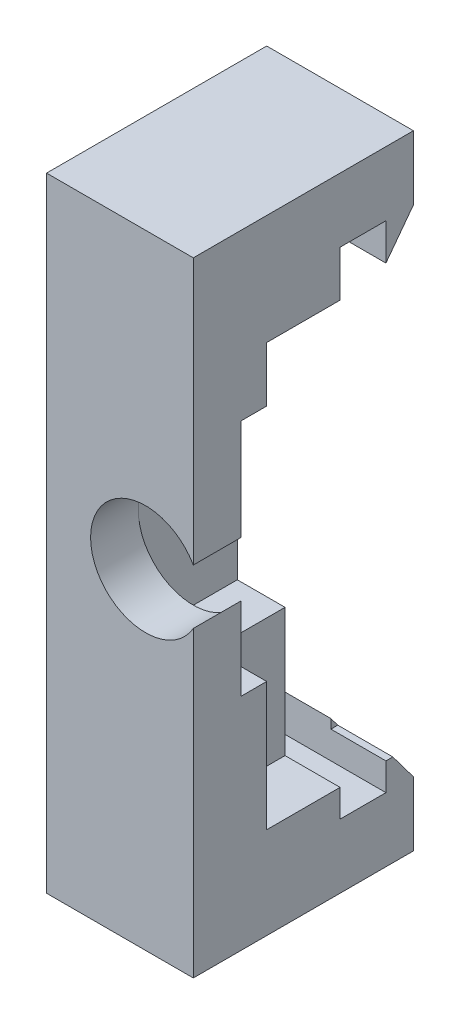
ISO-10303-21;
HEADER;
FILE_DESCRIPTION(('STEP AP214'),'2;1');
FILE_NAME('part.step','',(''),(''),'','','');
FILE_SCHEMA(('AUTOMOTIVE_DESIGN { 1 0 10303 214 1 1 1 1 }'));
ENDSEC;
DATA;
#1=APPLICATION_CONTEXT('core data for automotive mechanical design processes');
#2=APPLICATION_PROTOCOL_DEFINITION('international standard','automotive_design',2000,#1);
#3=PRODUCT_CONTEXT('',#1,'mechanical');
#4=PRODUCT('Part','Part','',(#3));
#5=PRODUCT_RELATED_PRODUCT_CATEGORY('part','',(#4));
#6=PRODUCT_DEFINITION_FORMATION('','',#4);
#7=PRODUCT_DEFINITION_CONTEXT('part definition',#1,'design');
#8=PRODUCT_DEFINITION('design','',#6,#7);
#9=PRODUCT_DEFINITION_SHAPE('','',#8);
#10=(LENGTH_UNIT() NAMED_UNIT(*) SI_UNIT(.MILLI.,.METRE.));
#11=(NAMED_UNIT(*) PLANE_ANGLE_UNIT() SI_UNIT($,.RADIAN.));
#12=(NAMED_UNIT(*) SI_UNIT($,.STERADIAN.) SOLID_ANGLE_UNIT());
#13=UNCERTAINTY_MEASURE_WITH_UNIT(LENGTH_MEASURE(1.E-05),#10,'distance_accuracy_value','');
#14=(GEOMETRIC_REPRESENTATION_CONTEXT(3) GLOBAL_UNCERTAINTY_ASSIGNED_CONTEXT((#13)) GLOBAL_UNIT_ASSIGNED_CONTEXT((#10,
#11,#12)) REPRESENTATION_CONTEXT('',''));
#15=CARTESIAN_POINT('',(0.,0.,0.));
#16=DIRECTION('',(0.,0.,1.));
#17=DIRECTION('',(1.,0.,0.));
#18=AXIS2_PLACEMENT_3D('',#15,#16,#17);
#19=CARTESIAN_POINT('',(4.,0.,6.));
#20=DIRECTION('',(-1.,0.,0.));
#21=DIRECTION('',(0.,0.,1.));
#22=AXIS2_PLACEMENT_3D('',#19,#20,#21);
#23=PLANE('',#22);
#24=DIRECTION('',(0.,1.,0.));
#25=VECTOR('',#24,1.);
#26=CARTESIAN_POINT('',(4.,0.,6.));
#27=LINE('',#26,#25);
#28=CARTESIAN_POINT('',(4.,9.74833147735479,6.));
#29=VERTEX_POINT('',#28);
#30=CARTESIAN_POINT('',(4.,17.,6.));
#31=VERTEX_POINT('',#30);
#32=EDGE_CURVE('E221',#29,#31,#27,.T.);
#33=ORIENTED_EDGE('',*,*,#32,.F.);
#34=DIRECTION('',(0.,0.,-1.));
#35=VECTOR('',#34,1.);
#36=CARTESIAN_POINT('',(4.,9.74833147735479,14.7));
#37=LINE('',#36,#35);
#38=CARTESIAN_POINT('',(4.,9.74833147735479,4.7));
#39=VERTEX_POINT('',#38);
#40=EDGE_CURVE('E209',#29,#39,#37,.T.);
#41=ORIENTED_EDGE('',*,*,#40,.T.);
#42=DIRECTION('',(0.,-1.,0.));
#43=VECTOR('',#42,1.);
#44=CARTESIAN_POINT('',(4.,12.5,4.7));
#45=LINE('',#44,#43);
#46=CARTESIAN_POINT('',(4.,12.5,4.7));
#47=VERTEX_POINT('',#46);
#48=EDGE_CURVE('E218',#47,#39,#45,.T.);
#49=ORIENTED_EDGE('',*,*,#48,.F.);
#50=DIRECTION('',(0.,0.,1.));
#51=VECTOR('',#50,1.);
#52=CARTESIAN_POINT('',(4.,12.5,0.));
#53=LINE('',#52,#51);
#54=CARTESIAN_POINT('',(4.,12.5,4.));
#55=VERTEX_POINT('',#54);
#56=EDGE_CURVE('E357',#55,#47,#53,.T.);
#57=ORIENTED_EDGE('',*,*,#56,.F.);
#58=DIRECTION('',(0.,-1.,0.));
#59=VECTOR('',#58,1.);
#60=CARTESIAN_POINT('',(4.,12.5,4.));
#61=LINE('',#60,#59);
#62=CARTESIAN_POINT('',(4.,14.,4.));
#63=VERTEX_POINT('',#62);
#64=EDGE_CURVE('E240',#63,#55,#61,.T.);
#65=ORIENTED_EDGE('',*,*,#64,.F.);
#66=DIRECTION('',(0.,0.,-1.));
#67=VECTOR('',#66,1.);
#68=CARTESIAN_POINT('',(4.,14.,4.));
#69=LINE('',#68,#67);
#70=CARTESIAN_POINT('',(4.,14.,2.));
#71=VERTEX_POINT('',#70);
#72=EDGE_CURVE('E257',#63,#71,#69,.T.);
#73=ORIENTED_EDGE('',*,*,#72,.T.);
#74=DIRECTION('',(0.,1.,0.));
#75=VECTOR('',#74,1.);
#76=CARTESIAN_POINT('',(4.,15.25,2.));
#77=LINE('',#76,#75);
#78=CARTESIAN_POINT('',(4.,15.25,2.));
#79=VERTEX_POINT('',#78);
#80=EDGE_CURVE('E282',#71,#79,#77,.T.);
#81=ORIENTED_EDGE('',*,*,#80,.T.);
#82=DIRECTION('',(0.,0.,-1.));
#83=VECTOR('',#82,1.);
#84=CARTESIAN_POINT('',(4.,15.25,0.750000000000002));
#85=LINE('',#84,#83);
#86=CARTESIAN_POINT('',(4.,15.25,0.750000000000002));
#87=VERTEX_POINT('',#86);
#88=EDGE_CURVE('E286',#79,#87,#85,.T.);
#89=ORIENTED_EDGE('',*,*,#88,.T.);
#90=DIRECTION('',(0.,-1.,0.));
#91=VECTOR('',#90,1.);
#92=CARTESIAN_POINT('',(4.,14.25,0.750000000000002));
#93=LINE('',#92,#91);
#94=CARTESIAN_POINT('',(4.,14.25,0.750000000000002));
#95=VERTEX_POINT('',#94);
#96=EDGE_CURVE('E289',#87,#95,#93,.T.);
#97=ORIENTED_EDGE('',*,*,#96,.T.);
#98=DIRECTION('',(0.,0.799999999999999,-0.600000000000001));
#99=VECTOR('',#98,1.);
#100=CARTESIAN_POINT('',(4.,15.25,0.));
#101=LINE('',#100,#99);
#102=CARTESIAN_POINT('',(4.,15.25,0.));
#103=VERTEX_POINT('',#102);
#104=EDGE_CURVE('E292',#95,#103,#101,.T.);
#105=ORIENTED_EDGE('',*,*,#104,.T.);
#106=DIRECTION('',(0.,1.,0.));
#107=VECTOR('',#106,1.);
#108=CARTESIAN_POINT('',(4.,0.,0.));
#109=LINE('',#108,#107);
#110=CARTESIAN_POINT('',(4.,17.,0.));
#111=VERTEX_POINT('',#110);
#112=EDGE_CURVE('E383',#103,#111,#109,.T.);
#113=ORIENTED_EDGE('',*,*,#112,.T.);
#114=DIRECTION('',(0.,0.,-1.));
#115=VECTOR('',#114,1.);
#116=CARTESIAN_POINT('',(4.,17.,6.));
#117=LINE('',#116,#115);
#118=EDGE_CURVE('E390',#31,#111,#117,.T.);
#119=ORIENTED_EDGE('',*,*,#118,.F.);
#120=EDGE_LOOP('',(#33,#41,#49,#57,#65,#73,#81,#89,#97,#105,#113,#119));
#121=FACE_BOUND('',#120,.T.);
#122=ADVANCED_FACE('F33',(#121),#23,.F.);
#123=CARTESIAN_POINT('',(10.6287253676706,12.5,4.7));
#124=DIRECTION('',(0.,0.,1.));
#125=DIRECTION('',(0.,-1.,0.));
#126=AXIS2_PLACEMENT_3D('',#123,#124,#125);
#127=PLANE('',#126);
#128=ORIENTED_EDGE('',*,*,#48,.T.);
#129=CARTESIAN_POINT('',(2.7,9.,4.7));
#130=DIRECTION('',(0.,0.,1.));
#131=DIRECTION('',(0.,-1.,0.));
#132=AXIS2_PLACEMENT_3D('',#129,#130,#131);
#133=CIRCLE('',#132,1.5);
#134=CARTESIAN_POINT('',(1.2,9.,4.7));
#135=VERTEX_POINT('',#134);
#136=EDGE_CURVE('E11',#39,#135,#133,.T.);
#137=ORIENTED_EDGE('',*,*,#136,.T.);
#138=DIRECTION('',(0.,1.,0.));
#139=VECTOR('',#138,1.);
#140=CARTESIAN_POINT('',(1.2,12.5,4.7));
#141=LINE('',#140,#139);
#142=CARTESIAN_POINT('',(1.2,12.5,4.7));
#143=VERTEX_POINT('',#142);
#144=EDGE_CURVE('E222',#135,#143,#141,.T.);
#145=ORIENTED_EDGE('',*,*,#144,.T.);
#146=DIRECTION('',(-1.,0.,0.));
#147=VECTOR('',#146,1.);
#148=CARTESIAN_POINT('',(10.6287253676706,12.5,4.7));
#149=LINE('',#148,#147);
#150=EDGE_CURVE('E226',#47,#143,#149,.T.);
#151=ORIENTED_EDGE('',*,*,#150,.F.);
#152=EDGE_LOOP('',(#128,#137,#145,#151));
#153=FACE_BOUND('',#152,.T.);
#154=ADVANCED_FACE('F224',(#153),#127,.F.);
#155=CARTESIAN_POINT('',(4.,6.,0.));
#156=DIRECTION('',(0.,-1.,0.));
#157=DIRECTION('',(1.,0.,0.));
#158=AXIS2_PLACEMENT_3D('',#155,#156,#157);
#159=PLANE('',#158);
#160=DIRECTION('',(-1.,0.,0.));
#161=VECTOR('',#160,1.);
#162=CARTESIAN_POINT('',(10.6287253676706,6.,4.7));
#163=LINE('',#162,#161);
#164=CARTESIAN_POINT('',(4.,6.,4.7));
#165=VERTEX_POINT('',#164);
#166=CARTESIAN_POINT('',(1.2,6.,4.7));
#167=VERTEX_POINT('',#166);
#168=EDGE_CURVE('E232',#165,#167,#163,.T.);
#169=ORIENTED_EDGE('',*,*,#168,.F.);
#170=DIRECTION('',(0.,0.,1.));
#171=VECTOR('',#170,1.);
#172=CARTESIAN_POINT('',(4.,6.,0.));
#173=LINE('',#172,#171);
#174=CARTESIAN_POINT('',(4.,6.,4.));
#175=VERTEX_POINT('',#174);
#176=EDGE_CURVE('E347',#175,#165,#173,.T.);
#177=ORIENTED_EDGE('',*,*,#176,.F.);
#178=DIRECTION('',(1.,0.,0.));
#179=VECTOR('',#178,1.);
#180=CARTESIAN_POINT('',(2.5,6.,4.));
#181=LINE('',#180,#179);
#182=CARTESIAN_POINT('',(2.5,6.,4.));
#183=VERTEX_POINT('',#182);
#184=EDGE_CURVE('E227',#183,#175,#181,.T.);
#185=ORIENTED_EDGE('',*,*,#184,.F.);
#186=DIRECTION('',(0.,0.,-1.));
#187=VECTOR('',#186,1.);
#188=CARTESIAN_POINT('',(2.5,6.,4.));
#189=LINE('',#188,#187);
#190=CARTESIAN_POINT('',(2.5,6.,2.));
#191=VERTEX_POINT('',#190);
#192=EDGE_CURVE('E230',#183,#191,#189,.T.);
#193=ORIENTED_EDGE('',*,*,#192,.T.);
#194=DIRECTION('',(-1.,0.,0.));
#195=VECTOR('',#194,1.);
#196=CARTESIAN_POINT('',(4.,6.,2.));
#197=LINE('',#196,#195);
#198=CARTESIAN_POINT('',(1.2,6.,2.));
#199=VERTEX_POINT('',#198);
#200=EDGE_CURVE('E333',#191,#199,#197,.T.);
#201=ORIENTED_EDGE('',*,*,#200,.T.);
#202=DIRECTION('',(0.,0.,1.));
#203=VECTOR('',#202,1.);
#204=CARTESIAN_POINT('',(1.2,6.,0.));
#205=LINE('',#204,#203);
#206=EDGE_CURVE('E351',#199,#167,#205,.T.);
#207=ORIENTED_EDGE('',*,*,#206,.T.);
#208=EDGE_LOOP('',(#169,#177,#185,#193,#201,#207));
#209=FACE_BOUND('',#208,.T.);
#210=ADVANCED_FACE('F417',(#209),#159,.F.);
#211=CARTESIAN_POINT('',(1.2,12.5,0.));
#212=DIRECTION('',(-1.,0.,0.));
#213=DIRECTION('',(0.,-1.,0.));
#214=AXIS2_PLACEMENT_3D('',#211,#212,#213);
#215=PLANE('',#214);
#216=EDGE_CURVE('E235',#167,#135,#141,.T.);
#217=ORIENTED_EDGE('',*,*,#216,.F.);
#218=ORIENTED_EDGE('',*,*,#206,.F.);
#219=DIRECTION('',(0.,1.,0.));
#220=VECTOR('',#219,1.);
#221=CARTESIAN_POINT('',(1.2,12.5,2.));
#222=LINE('',#221,#220);
#223=CARTESIAN_POINT('',(1.2,12.5,2.));
#224=VERTEX_POINT('',#223);
#225=EDGE_CURVE('E317',#199,#224,#222,.T.);
#226=ORIENTED_EDGE('',*,*,#225,.T.);
#227=DIRECTION('',(0.,0.,1.));
#228=VECTOR('',#227,1.);
#229=CARTESIAN_POINT('',(1.2,12.5,0.));
#230=LINE('',#229,#228);
#231=EDGE_CURVE('E354',#224,#143,#230,.T.);
#232=ORIENTED_EDGE('',*,*,#231,.T.);
#233=ORIENTED_EDGE('',*,*,#144,.F.);
#234=EDGE_LOOP('',(#217,#218,#226,#232,#233));
#235=FACE_BOUND('',#234,.T.);
#236=ADVANCED_FACE('F422',(#235),#215,.F.);
#237=CARTESIAN_POINT('',(4.,12.5,0.));
#238=DIRECTION('',(0.,1.,0.));
#239=DIRECTION('',(-1.,0.,0.));
#240=AXIS2_PLACEMENT_3D('',#237,#238,#239);
#241=PLANE('',#240);
#242=ORIENTED_EDGE('',*,*,#150,.T.);
#243=ORIENTED_EDGE('',*,*,#231,.F.);
#244=DIRECTION('',(1.,0.,0.));
#245=VECTOR('',#244,1.);
#246=CARTESIAN_POINT('',(4.,12.5,2.));
#247=LINE('',#246,#245);
#248=CARTESIAN_POINT('',(2.5,12.5,2.));
#249=VERTEX_POINT('',#248);
#250=EDGE_CURVE('E399',#224,#249,#247,.T.);
#251=ORIENTED_EDGE('',*,*,#250,.T.);
#252=DIRECTION('',(0.,0.,-1.));
#253=VECTOR('',#252,1.);
#254=CARTESIAN_POINT('',(2.5,12.5,4.));
#255=LINE('',#254,#253);
#256=CARTESIAN_POINT('',(2.5,12.5,4.));
#257=VERTEX_POINT('',#256);
#258=EDGE_CURVE('E252',#257,#249,#255,.T.);
#259=ORIENTED_EDGE('',*,*,#258,.F.);
#260=DIRECTION('',(-1.,0.,0.));
#261=VECTOR('',#260,1.);
#262=CARTESIAN_POINT('',(4.,12.5,4.));
#263=LINE('',#262,#261);
#264=EDGE_CURVE('E242',#55,#257,#263,.T.);
#265=ORIENTED_EDGE('',*,*,#264,.F.);
#266=ORIENTED_EDGE('',*,*,#56,.T.);
#267=EDGE_LOOP('',(#242,#243,#251,#259,#265,#266));
#268=FACE_BOUND('',#267,.T.);
#269=ADVANCED_FACE('F425',(#268),#241,.F.);
#270=CARTESIAN_POINT('',(0.,0.,0.));
#271=DIRECTION('',(0.,0.,-1.));
#272=DIRECTION('',(-1.,0.,0.));
#273=AXIS2_PLACEMENT_3D('',#270,#271,#272);
#274=PLANE('',#273);
#275=DIRECTION('',(-1.,0.,0.));
#276=VECTOR('',#275,1.);
#277=CARTESIAN_POINT('',(4.,15.25,0.));
#278=LINE('',#277,#276);
#279=CARTESIAN_POINT('',(0.,15.25,0.));
#280=VERTEX_POINT('',#279);
#281=EDGE_CURVE('E314',#103,#280,#278,.T.);
#282=ORIENTED_EDGE('',*,*,#281,.T.);
#283=DIRECTION('',(0.,-1.,0.));
#284=VECTOR('',#283,1.);
#285=CARTESIAN_POINT('',(0.,0.,0.));
#286=LINE('',#285,#284);
#287=CARTESIAN_POINT('',(0.,17.,0.));
#288=VERTEX_POINT('',#287);
#289=EDGE_CURVE('E378',#288,#280,#286,.T.);
#290=ORIENTED_EDGE('',*,*,#289,.F.);
#291=DIRECTION('',(-1.,0.,0.));
#292=VECTOR('',#291,1.);
#293=CARTESIAN_POINT('',(0.,17.,0.));
#294=LINE('',#293,#292);
#295=EDGE_CURVE('E370',#111,#288,#294,.T.);
#296=ORIENTED_EDGE('',*,*,#295,.F.);
#297=ORIENTED_EDGE('',*,*,#112,.F.);
#298=EDGE_LOOP('',(#282,#290,#296,#297));
#299=FACE_BOUND('',#298,.T.);
#300=ADVANCED_FACE('F455',(#299),#274,.T.);
#301=CARTESIAN_POINT('',(4.,2.5,0.));
#302=DIRECTION('',(0.,-1.,0.));
#303=DIRECTION('',(0.,0.,-1.));
#304=AXIS2_PLACEMENT_3D('',#301,#302,#303);
#305=PLANE('',#304);
#306=DIRECTION('',(0.,0.,1.));
#307=VECTOR('',#306,1.);
#308=CARTESIAN_POINT('',(2.5,2.5,0.));
#309=LINE('',#308,#307);
#310=CARTESIAN_POINT('',(2.5,2.5,2.));
#311=VERTEX_POINT('',#310);
#312=CARTESIAN_POINT('',(2.5,2.5,4.));
#313=VERTEX_POINT('',#312);
#314=EDGE_CURVE('E346',#311,#313,#309,.T.);
#315=ORIENTED_EDGE('',*,*,#314,.T.);
#316=DIRECTION('',(1.,0.,0.));
#317=VECTOR('',#316,1.);
#318=CARTESIAN_POINT('',(2.,2.5,4.));
#319=LINE('',#318,#317);
#320=CARTESIAN_POINT('',(4.,2.5,4.));
#321=VERTEX_POINT('',#320);
#322=EDGE_CURVE('E267',#313,#321,#319,.T.);
#323=ORIENTED_EDGE('',*,*,#322,.T.);
#324=DIRECTION('',(0.,0.,1.));
#325=VECTOR('',#324,1.);
#326=CARTESIAN_POINT('',(4.,2.5,0.));
#327=LINE('',#326,#325);
#328=CARTESIAN_POINT('',(4.,2.5,2.));
#329=VERTEX_POINT('',#328);
#330=EDGE_CURVE('E360',#329,#321,#327,.T.);
#331=ORIENTED_EDGE('',*,*,#330,.F.);
#332=DIRECTION('',(-1.,0.,0.));
#333=VECTOR('',#332,1.);
#334=CARTESIAN_POINT('',(4.,2.5,2.));
#335=LINE('',#334,#333);
#336=EDGE_CURVE('E337',#329,#311,#335,.T.);
#337=ORIENTED_EDGE('',*,*,#336,.T.);
#338=EDGE_LOOP('',(#315,#323,#331,#337));
#339=FACE_BOUND('',#338,.T.);
#340=ADVANCED_FACE('F497',(#339),#305,.F.);
#341=CARTESIAN_POINT('',(2.5,5.25,0.));
#342=DIRECTION('',(-1.,0.,0.));
#343=DIRECTION('',(0.,0.,1.));
#344=AXIS2_PLACEMENT_3D('',#341,#342,#343);
#345=PLANE('',#344);
#346=DIRECTION('',(0.,1.,0.));
#347=VECTOR('',#346,1.);
#348=CARTESIAN_POINT('',(2.5,5.25,2.));
#349=LINE('',#348,#347);
#350=EDGE_CURVE('E335',#311,#191,#349,.T.);
#351=ORIENTED_EDGE('',*,*,#350,.T.);
#352=ORIENTED_EDGE('',*,*,#192,.F.);
#353=DIRECTION('',(0.,-1.,0.));
#354=VECTOR('',#353,1.);
#355=CARTESIAN_POINT('',(2.5,5.25,4.));
#356=LINE('',#355,#354);
#357=EDGE_CURVE('E269',#183,#313,#356,.T.);
#358=ORIENTED_EDGE('',*,*,#357,.T.);
#359=ORIENTED_EDGE('',*,*,#314,.F.);
#360=EDGE_LOOP('',(#351,#352,#358,#359));
#361=FACE_BOUND('',#360,.T.);
#362=ADVANCED_FACE('F500',(#361),#345,.F.);
#363=CARTESIAN_POINT('',(0.,0.,6.));
#364=DIRECTION('',(1.,0.,0.));
#365=DIRECTION('',(0.,0.,-1.));
#366=AXIS2_PLACEMENT_3D('',#363,#364,#365);
#367=PLANE('',#366);
#368=ORIENTED_EDGE('',*,*,#289,.T.);
#369=DIRECTION('',(0.,0.799999999999999,-0.600000000000001));
#370=VECTOR('',#369,1.);
#371=CARTESIAN_POINT('',(0.,15.25,0.));
#372=LINE('',#371,#370);
#373=CARTESIAN_POINT('',(0.,14.25,0.750000000000002));
#374=VERTEX_POINT('',#373);
#375=EDGE_CURVE('E276',#374,#280,#372,.T.);
#376=ORIENTED_EDGE('',*,*,#375,.F.);
#377=DIRECTION('',(0.,-1.,0.));
#378=VECTOR('',#377,1.);
#379=CARTESIAN_POINT('',(0.,14.25,0.750000000000002));
#380=LINE('',#379,#378);
#381=CARTESIAN_POINT('',(0.,15.25,0.750000000000002));
#382=VERTEX_POINT('',#381);
#383=EDGE_CURVE('E310',#382,#374,#380,.T.);
#384=ORIENTED_EDGE('',*,*,#383,.F.);
#385=DIRECTION('',(0.,0.,-1.));
#386=VECTOR('',#385,1.);
#387=CARTESIAN_POINT('',(0.,15.25,0.750000000000002));
#388=LINE('',#387,#386);
#389=CARTESIAN_POINT('',(0.,15.25,2.));
#390=VERTEX_POINT('',#389);
#391=EDGE_CURVE('E307',#390,#382,#388,.T.);
#392=ORIENTED_EDGE('',*,*,#391,.F.);
#393=DIRECTION('',(0.,1.,0.));
#394=VECTOR('',#393,1.);
#395=CARTESIAN_POINT('',(0.,15.25,2.));
#396=LINE('',#395,#394);
#397=CARTESIAN_POINT('',(0.,1.75,2.));
#398=VERTEX_POINT('',#397);
#399=EDGE_CURVE('E304',#398,#390,#396,.T.);
#400=ORIENTED_EDGE('',*,*,#399,.F.);
#401=DIRECTION('',(0.,0.,1.));
#402=VECTOR('',#401,1.);
#403=CARTESIAN_POINT('',(0.,1.75,0.750000000000002));
#404=LINE('',#403,#402);
#405=CARTESIAN_POINT('',(0.,1.75,0.750000000000002));
#406=VERTEX_POINT('',#405);
#407=EDGE_CURVE('E301',#406,#398,#404,.T.);
#408=ORIENTED_EDGE('',*,*,#407,.F.);
#409=DIRECTION('',(0.,-1.,0.));
#410=VECTOR('',#409,1.);
#411=CARTESIAN_POINT('',(0.,2.75,0.750000000000002));
#412=LINE('',#411,#410);
#413=CARTESIAN_POINT('',(0.,2.75,0.750000000000002));
#414=VERTEX_POINT('',#413);
#415=EDGE_CURVE('E298',#414,#406,#412,.T.);
#416=ORIENTED_EDGE('',*,*,#415,.F.);
#417=DIRECTION('',(0.,0.799999999999999,0.600000000000001));
#418=VECTOR('',#417,1.);
#419=CARTESIAN_POINT('',(0.,1.75,0.));
#420=LINE('',#419,#418);
#421=CARTESIAN_POINT('',(0.,1.75,0.));
#422=VERTEX_POINT('',#421);
#423=EDGE_CURVE('E271',#422,#414,#420,.T.);
#424=ORIENTED_EDGE('',*,*,#423,.F.);
#425=CARTESIAN_POINT('',(0.,0.,0.));
#426=VERTEX_POINT('',#425);
#427=EDGE_CURVE('E350',#422,#426,#286,.T.);
#428=ORIENTED_EDGE('',*,*,#427,.T.);
#429=DIRECTION('',(0.,0.,-1.));
#430=VECTOR('',#429,1.);
#431=CARTESIAN_POINT('',(0.,0.,6.));
#432=LINE('',#431,#430);
#433=CARTESIAN_POINT('',(0.,0.,6.));
#434=VERTEX_POINT('',#433);
#435=EDGE_CURVE('E396',#434,#426,#432,.T.);
#436=ORIENTED_EDGE('',*,*,#435,.F.);
#437=DIRECTION('',(0.,-1.,0.));
#438=VECTOR('',#437,1.);
#439=CARTESIAN_POINT('',(0.,0.,6.));
#440=LINE('',#439,#438);
#441=CARTESIAN_POINT('',(0.,17.,6.));
#442=VERTEX_POINT('',#441);
#443=EDGE_CURVE('E366',#442,#434,#440,.T.);
#444=ORIENTED_EDGE('',*,*,#443,.F.);
#445=DIRECTION('',(0.,0.,-1.));
#446=VECTOR('',#445,1.);
#447=CARTESIAN_POINT('',(0.,17.,6.));
#448=LINE('',#447,#446);
#449=EDGE_CURVE('E377',#442,#288,#448,.T.);
#450=ORIENTED_EDGE('',*,*,#449,.T.);
#451=EDGE_LOOP('',(#368,#376,#384,#392,#400,#408,#416,#424,#428,#436,#444,#450));
#452=FACE_BOUND('',#451,.T.);
#453=ADVANCED_FACE('F35',(#452),#367,.F.);
#454=CARTESIAN_POINT('',(0.,0.,6.));
#455=DIRECTION('',(0.,1.,0.));
#456=DIRECTION('',(0.,0.,1.));
#457=AXIS2_PLACEMENT_3D('',#454,#455,#456);
#458=PLANE('',#457);
#459=DIRECTION('',(1.,0.,0.));
#460=VECTOR('',#459,1.);
#461=CARTESIAN_POINT('',(0.,0.,0.));
#462=LINE('',#461,#460);
#463=CARTESIAN_POINT('',(4.,0.,0.));
#464=VERTEX_POINT('',#463);
#465=EDGE_CURVE('E381',#426,#464,#462,.T.);
#466=ORIENTED_EDGE('',*,*,#465,.T.);
#467=DIRECTION('',(0.,0.,-1.));
#468=VECTOR('',#467,1.);
#469=CARTESIAN_POINT('',(4.,0.,6.));
#470=LINE('',#469,#468);
#471=CARTESIAN_POINT('',(4.,0.,6.));
#472=VERTEX_POINT('',#471);
#473=EDGE_CURVE('E393',#472,#464,#470,.T.);
#474=ORIENTED_EDGE('',*,*,#473,.F.);
#475=DIRECTION('',(1.,0.,0.));
#476=VECTOR('',#475,1.);
#477=CARTESIAN_POINT('',(0.,0.,6.));
#478=LINE('',#477,#476);
#479=EDGE_CURVE('E369',#434,#472,#478,.T.);
#480=ORIENTED_EDGE('',*,*,#479,.F.);
#481=ORIENTED_EDGE('',*,*,#435,.T.);
#482=EDGE_LOOP('',(#466,#474,#480,#481));
#483=FACE_BOUND('',#482,.T.);
#484=ADVANCED_FACE('F523',(#483),#458,.F.);
#485=CARTESIAN_POINT('',(4.,8.25166852264521,4.7));
#486=VERTEX_POINT('',#485);
#487=EDGE_CURVE('E55',#486,#165,#45,.T.);
#488=ORIENTED_EDGE('',*,*,#487,.F.);
#489=DIRECTION('',(0.,0.,-1.));
#490=VECTOR('',#489,1.);
#491=CARTESIAN_POINT('',(4.,8.25166852264521,14.7));
#492=LINE('',#491,#490);
#493=CARTESIAN_POINT('',(4.,8.25166852264521,6.));
#494=VERTEX_POINT('',#493);
#495=EDGE_CURVE('E48',#486,#494,#492,.F.);
#496=ORIENTED_EDGE('',*,*,#495,.T.);
#497=EDGE_CURVE('E372',#472,#494,#27,.T.);
#498=ORIENTED_EDGE('',*,*,#497,.F.);
#499=ORIENTED_EDGE('',*,*,#473,.T.);
#500=CARTESIAN_POINT('',(4.,1.75,0.));
#501=VERTEX_POINT('',#500);
#502=EDGE_CURVE('E384',#464,#501,#109,.T.);
#503=ORIENTED_EDGE('',*,*,#502,.T.);
#504=DIRECTION('',(0.,0.799999999999999,0.600000000000001));
#505=VECTOR('',#504,1.);
#506=CARTESIAN_POINT('',(4.,1.75,0.));
#507=LINE('',#506,#505);
#508=CARTESIAN_POINT('',(4.,2.5,0.562500000000002));
#509=VERTEX_POINT('',#508);
#510=EDGE_CURVE('E272',#501,#509,#507,.T.);
#511=ORIENTED_EDGE('',*,*,#510,.T.);
#512=CARTESIAN_POINT('',(4.,2.5,0.750000000000002));
#513=VERTEX_POINT('',#512);
#514=EDGE_CURVE('E359',#509,#513,#327,.T.);
#515=ORIENTED_EDGE('',*,*,#514,.T.);
#516=DIRECTION('',(0.,-1.,0.));
#517=VECTOR('',#516,1.);
#518=CARTESIAN_POINT('',(4.,2.75,0.750000000000002));
#519=LINE('',#518,#517);
#520=CARTESIAN_POINT('',(4.,1.75,0.750000000000002));
#521=VERTEX_POINT('',#520);
#522=EDGE_CURVE('E275',#513,#521,#519,.T.);
#523=ORIENTED_EDGE('',*,*,#522,.T.);
#524=DIRECTION('',(0.,0.,1.));
#525=VECTOR('',#524,1.);
#526=CARTESIAN_POINT('',(4.,1.75,0.750000000000002));
#527=LINE('',#526,#525);
#528=CARTESIAN_POINT('',(4.,1.75,2.));
#529=VERTEX_POINT('',#528);
#530=EDGE_CURVE('E279',#521,#529,#527,.T.);
#531=ORIENTED_EDGE('',*,*,#530,.T.);
#532=EDGE_CURVE('E283',#529,#329,#77,.T.);
#533=ORIENTED_EDGE('',*,*,#532,.T.);
#534=ORIENTED_EDGE('',*,*,#330,.T.);
#535=DIRECTION('',(0.,1.,0.));
#536=VECTOR('',#535,1.);
#537=CARTESIAN_POINT('',(4.,5.25,4.));
#538=LINE('',#537,#536);
#539=EDGE_CURVE('E260',#321,#175,#538,.T.);
#540=ORIENTED_EDGE('',*,*,#539,.T.);
#541=ORIENTED_EDGE('',*,*,#176,.T.);
#542=EDGE_LOOP('',(#488,#496,#498,#499,#503,#511,#515,#523,#531,#533,#534,#540,#541));
#543=FACE_BOUND('',#542,.T.);
#544=ADVANCED_FACE('F411',(#543),#23,.F.);
#545=CARTESIAN_POINT('',(0.,17.,6.));
#546=DIRECTION('',(0.,-1.,0.));
#547=DIRECTION('',(0.,0.,-1.));
#548=AXIS2_PLACEMENT_3D('',#545,#546,#547);
#549=PLANE('',#548);
#550=ORIENTED_EDGE('',*,*,#295,.T.);
#551=ORIENTED_EDGE('',*,*,#449,.F.);
#552=DIRECTION('',(-1.,0.,0.));
#553=VECTOR('',#552,1.);
#554=CARTESIAN_POINT('',(0.,17.,6.));
#555=LINE('',#554,#553);
#556=EDGE_CURVE('E375',#31,#442,#555,.T.);
#557=ORIENTED_EDGE('',*,*,#556,.F.);
#558=ORIENTED_EDGE('',*,*,#118,.T.);
#559=EDGE_LOOP('',(#550,#551,#557,#558));
#560=FACE_BOUND('',#559,.T.);
#561=ADVANCED_FACE('F459',(#560),#549,.F.);
#562=CARTESIAN_POINT('',(0.,0.,6.));
#563=DIRECTION('',(0.,0.,-1.));
#564=DIRECTION('',(-1.,0.,0.));
#565=AXIS2_PLACEMENT_3D('',#562,#563,#564);
#566=PLANE('',#565);
#567=ORIENTED_EDGE('',*,*,#497,.T.);
#568=CARTESIAN_POINT('',(2.7,9.,6.));
#569=DIRECTION('',(0.,0.,-1.));
#570=DIRECTION('',(-1.,0.,0.));
#571=AXIS2_PLACEMENT_3D('',#568,#569,#570);
#572=CIRCLE('',#571,1.5);
#573=EDGE_CURVE('E467',#494,#29,#572,.T.);
#574=ORIENTED_EDGE('',*,*,#573,.T.);
#575=ORIENTED_EDGE('',*,*,#32,.T.);
#576=ORIENTED_EDGE('',*,*,#556,.T.);
#577=ORIENTED_EDGE('',*,*,#443,.T.);
#578=ORIENTED_EDGE('',*,*,#479,.T.);
#579=EDGE_LOOP('',(#567,#574,#575,#576,#577,#578));
#580=FACE_BOUND('',#579,.T.);
#581=ADVANCED_FACE('F465',(#580),#566,.F.);
#582=DIRECTION('',(-1.,0.,0.));
#583=VECTOR('',#582,1.);
#584=CARTESIAN_POINT('',(4.,1.75,0.));
#585=LINE('',#584,#583);
#586=EDGE_CURVE('E295',#501,#422,#585,.T.);
#587=ORIENTED_EDGE('',*,*,#586,.F.);
#588=ORIENTED_EDGE('',*,*,#502,.F.);
#589=ORIENTED_EDGE('',*,*,#465,.F.);
#590=ORIENTED_EDGE('',*,*,#427,.F.);
#591=EDGE_LOOP('',(#587,#588,#589,#590));
#592=FACE_BOUND('',#591,.T.);
#593=ADVANCED_FACE('F474',(#592),#274,.T.);
#594=CARTESIAN_POINT('',(2.5,2.5,0.562500000000002));
#595=VERTEX_POINT('',#594);
#596=CARTESIAN_POINT('',(2.5,2.5,0.750000000000002));
#597=VERTEX_POINT('',#596);
#598=EDGE_CURVE('E363',#595,#597,#309,.T.);
#599=ORIENTED_EDGE('',*,*,#598,.T.);
#600=DIRECTION('',(1.,0.,0.));
#601=VECTOR('',#600,1.);
#602=CARTESIAN_POINT('',(4.,2.5,0.750000000000002));
#603=LINE('',#602,#601);
#604=EDGE_CURVE('E343',#597,#513,#603,.T.);
#605=ORIENTED_EDGE('',*,*,#604,.T.);
#606=ORIENTED_EDGE('',*,*,#514,.F.);
#607=DIRECTION('',(-1.,0.,0.));
#608=VECTOR('',#607,1.);
#609=CARTESIAN_POINT('',(4.,2.5,0.562500000000002));
#610=LINE('',#609,#608);
#611=EDGE_CURVE('E340',#509,#595,#610,.T.);
#612=ORIENTED_EDGE('',*,*,#611,.T.);
#613=EDGE_LOOP('',(#599,#605,#606,#612));
#614=FACE_BOUND('',#613,.T.);
#615=ADVANCED_FACE('F488',(#614),#305,.F.);
#616=DIRECTION('',(0.,0.799999999999999,0.600000000000001));
#617=VECTOR('',#616,1.);
#618=CARTESIAN_POINT('',(2.5,3.98999999999999,1.68));
#619=LINE('',#618,#617);
#620=CARTESIAN_POINT('',(2.5,2.75,0.750000000000002));
#621=VERTEX_POINT('',#620);
#622=EDGE_CURVE('E402',#595,#621,#619,.T.);
#623=ORIENTED_EDGE('',*,*,#622,.T.);
#624=DIRECTION('',(0.,-1.,0.));
#625=VECTOR('',#624,1.);
#626=CARTESIAN_POINT('',(2.5,5.25,0.750000000000002));
#627=LINE('',#626,#625);
#628=EDGE_CURVE('E404',#621,#597,#627,.T.);
#629=ORIENTED_EDGE('',*,*,#628,.T.);
#630=ORIENTED_EDGE('',*,*,#598,.F.);
#631=EDGE_LOOP('',(#623,#629,#630));
#632=FACE_BOUND('',#631,.T.);
#633=ADVANCED_FACE('F486',(#632),#345,.F.);
#634=CARTESIAN_POINT('',(4.,2.75,0.750000000000002));
#635=DIRECTION('',(0.,0.,-1.));
#636=DIRECTION('',(-1.,0.,0.));
#637=AXIS2_PLACEMENT_3D('',#634,#635,#636);
#638=PLANE('',#637);
#639=ORIENTED_EDGE('',*,*,#628,.F.);
#640=DIRECTION('',(-1.,0.,0.));
#641=VECTOR('',#640,1.);
#642=CARTESIAN_POINT('',(4.,2.75,0.750000000000002));
#643=LINE('',#642,#641);
#644=EDGE_CURVE('E328',#621,#414,#643,.T.);
#645=ORIENTED_EDGE('',*,*,#644,.T.);
#646=ORIENTED_EDGE('',*,*,#415,.T.);
#647=DIRECTION('',(-1.,0.,0.));
#648=VECTOR('',#647,1.);
#649=CARTESIAN_POINT('',(4.,1.75,0.750000000000002));
#650=LINE('',#649,#648);
#651=EDGE_CURVE('E326',#521,#406,#650,.T.);
#652=ORIENTED_EDGE('',*,*,#651,.F.);
#653=ORIENTED_EDGE('',*,*,#522,.F.);
#654=ORIENTED_EDGE('',*,*,#604,.F.);
#655=EDGE_LOOP('',(#639,#645,#646,#652,#653,#654));
#656=FACE_BOUND('',#655,.T.);
#657=ADVANCED_FACE('F484',(#656),#638,.F.);
#658=CARTESIAN_POINT('',(4.,1.75,0.));
#659=DIRECTION('',(0.,-0.600000000000001,0.799999999999999));
#660=DIRECTION('',(0.,-0.799999999999999,-0.600000000000001));
#661=AXIS2_PLACEMENT_3D('',#658,#659,#660);
#662=PLANE('',#661);
#663=ORIENTED_EDGE('',*,*,#510,.F.);
#664=ORIENTED_EDGE('',*,*,#586,.T.);
#665=ORIENTED_EDGE('',*,*,#423,.T.);
#666=ORIENTED_EDGE('',*,*,#644,.F.);
#667=ORIENTED_EDGE('',*,*,#622,.F.);
#668=ORIENTED_EDGE('',*,*,#611,.F.);
#669=EDGE_LOOP('',(#663,#664,#665,#666,#667,#668));
#670=FACE_BOUND('',#669,.T.);
#671=ADVANCED_FACE('F478',(#670),#662,.F.);
#672=CARTESIAN_POINT('',(4.,15.25,2.));
#673=DIRECTION('',(0.,0.,1.));
#674=DIRECTION('',(1.,0.,0.));
#675=AXIS2_PLACEMENT_3D('',#672,#673,#674);
#676=PLANE('',#675);
#677=ORIENTED_EDGE('',*,*,#80,.F.);
#678=DIRECTION('',(1.,0.,0.));
#679=VECTOR('',#678,1.);
#680=CARTESIAN_POINT('',(4.,14.,2.));
#681=LINE('',#680,#679);
#682=CARTESIAN_POINT('',(2.5,14.,2.));
#683=VERTEX_POINT('',#682);
#684=EDGE_CURVE('E243',#683,#71,#681,.T.);
#685=ORIENTED_EDGE('',*,*,#684,.F.);
#686=DIRECTION('',(0.,1.,0.));
#687=VECTOR('',#686,1.);
#688=CARTESIAN_POINT('',(2.5,12.5,2.));
#689=LINE('',#688,#687);
#690=EDGE_CURVE('E253',#249,#683,#689,.T.);
#691=ORIENTED_EDGE('',*,*,#690,.F.);
#692=ORIENTED_EDGE('',*,*,#250,.F.);
#693=ORIENTED_EDGE('',*,*,#225,.F.);
#694=ORIENTED_EDGE('',*,*,#200,.F.);
#695=ORIENTED_EDGE('',*,*,#350,.F.);
#696=ORIENTED_EDGE('',*,*,#336,.F.);
#697=ORIENTED_EDGE('',*,*,#532,.F.);
#698=DIRECTION('',(-1.,0.,0.));
#699=VECTOR('',#698,1.);
#700=CARTESIAN_POINT('',(4.,1.75,2.));
#701=LINE('',#700,#699);
#702=EDGE_CURVE('E324',#529,#398,#701,.T.);
#703=ORIENTED_EDGE('',*,*,#702,.T.);
#704=ORIENTED_EDGE('',*,*,#399,.T.);
#705=DIRECTION('',(-1.,0.,0.));
#706=VECTOR('',#705,1.);
#707=CARTESIAN_POINT('',(4.,15.25,2.));
#708=LINE('',#707,#706);
#709=EDGE_CURVE('E322',#79,#390,#708,.T.);
#710=ORIENTED_EDGE('',*,*,#709,.F.);
#711=EDGE_LOOP('',(#677,#685,#691,#692,#693,#694,#695,#696,#697,#703,#704,#710));
#712=FACE_BOUND('',#711,.T.);
#713=ADVANCED_FACE('F438',(#712),#676,.F.);
#714=CARTESIAN_POINT('',(4.,15.25,0.));
#715=DIRECTION('',(0.,0.600000000000001,0.799999999999999));
#716=DIRECTION('',(0.,-0.799999999999999,0.600000000000001));
#717=AXIS2_PLACEMENT_3D('',#714,#715,#716);
#718=PLANE('',#717);
#719=ORIENTED_EDGE('',*,*,#375,.T.);
#720=ORIENTED_EDGE('',*,*,#281,.F.);
#721=ORIENTED_EDGE('',*,*,#104,.F.);
#722=DIRECTION('',(-1.,0.,0.));
#723=VECTOR('',#722,1.);
#724=CARTESIAN_POINT('',(4.,14.25,0.750000000000002));
#725=LINE('',#724,#723);
#726=EDGE_CURVE('E318',#95,#374,#725,.T.);
#727=ORIENTED_EDGE('',*,*,#726,.T.);
#728=EDGE_LOOP('',(#719,#720,#721,#727));
#729=FACE_BOUND('',#728,.T.);
#730=ADVANCED_FACE('F451',(#729),#718,.F.);
#731=CARTESIAN_POINT('',(4.,14.25,0.750000000000002));
#732=DIRECTION('',(0.,0.,-1.));
#733=DIRECTION('',(-1.,0.,0.));
#734=AXIS2_PLACEMENT_3D('',#731,#732,#733);
#735=PLANE('',#734);
#736=ORIENTED_EDGE('',*,*,#383,.T.);
#737=ORIENTED_EDGE('',*,*,#726,.F.);
#738=ORIENTED_EDGE('',*,*,#96,.F.);
#739=DIRECTION('',(-1.,0.,0.));
#740=VECTOR('',#739,1.);
#741=CARTESIAN_POINT('',(4.,15.25,0.750000000000002));
#742=LINE('',#741,#740);
#743=EDGE_CURVE('E320',#87,#382,#742,.T.);
#744=ORIENTED_EDGE('',*,*,#743,.T.);
#745=EDGE_LOOP('',(#736,#737,#738,#744));
#746=FACE_BOUND('',#745,.T.);
#747=ADVANCED_FACE('F447',(#746),#735,.F.);
#748=CARTESIAN_POINT('',(4.,15.25,0.750000000000002));
#749=DIRECTION('',(0.,1.,0.));
#750=DIRECTION('',(0.,0.,1.));
#751=AXIS2_PLACEMENT_3D('',#748,#749,#750);
#752=PLANE('',#751);
#753=ORIENTED_EDGE('',*,*,#391,.T.);
#754=ORIENTED_EDGE('',*,*,#743,.F.);
#755=ORIENTED_EDGE('',*,*,#88,.F.);
#756=ORIENTED_EDGE('',*,*,#709,.T.);
#757=EDGE_LOOP('',(#753,#754,#755,#756));
#758=FACE_BOUND('',#757,.T.);
#759=ADVANCED_FACE('F443',(#758),#752,.F.);
#760=CARTESIAN_POINT('',(4.,1.75,0.750000000000002));
#761=DIRECTION('',(0.,-1.,0.));
#762=DIRECTION('',(0.,0.,-1.));
#763=AXIS2_PLACEMENT_3D('',#760,#761,#762);
#764=PLANE('',#763);
#765=ORIENTED_EDGE('',*,*,#407,.T.);
#766=ORIENTED_EDGE('',*,*,#702,.F.);
#767=ORIENTED_EDGE('',*,*,#530,.F.);
#768=ORIENTED_EDGE('',*,*,#651,.T.);
#769=EDGE_LOOP('',(#765,#766,#767,#768));
#770=FACE_BOUND('',#769,.T.);
#771=ADVANCED_FACE('F494',(#770),#764,.F.);
#772=CARTESIAN_POINT('',(2.,5.25,4.));
#773=DIRECTION('',(0.,0.,-1.));
#774=DIRECTION('',(-1.,0.,0.));
#775=AXIS2_PLACEMENT_3D('',#772,#773,#774);
#776=PLANE('',#775);
#777=ORIENTED_EDGE('',*,*,#357,.F.);
#778=ORIENTED_EDGE('',*,*,#184,.T.);
#779=ORIENTED_EDGE('',*,*,#539,.F.);
#780=ORIENTED_EDGE('',*,*,#322,.F.);
#781=EDGE_LOOP('',(#777,#778,#779,#780));
#782=FACE_BOUND('',#781,.T.);
#783=ADVANCED_FACE('F503',(#782),#776,.T.);
#784=CARTESIAN_POINT('',(4.,14.,4.));
#785=DIRECTION('',(0.,1.,0.));
#786=DIRECTION('',(0.,0.,1.));
#787=AXIS2_PLACEMENT_3D('',#784,#785,#786);
#788=PLANE('',#787);
#789=ORIENTED_EDGE('',*,*,#684,.T.);
#790=ORIENTED_EDGE('',*,*,#72,.F.);
#791=DIRECTION('',(1.,0.,0.));
#792=VECTOR('',#791,1.);
#793=CARTESIAN_POINT('',(4.,14.,4.));
#794=LINE('',#793,#792);
#795=CARTESIAN_POINT('',(2.5,14.,4.));
#796=VERTEX_POINT('',#795);
#797=EDGE_CURVE('E249',#796,#63,#794,.T.);
#798=ORIENTED_EDGE('',*,*,#797,.F.);
#799=DIRECTION('',(0.,0.,-1.));
#800=VECTOR('',#799,1.);
#801=CARTESIAN_POINT('',(2.5,14.,4.));
#802=LINE('',#801,#800);
#803=EDGE_CURVE('E261',#796,#683,#802,.T.);
#804=ORIENTED_EDGE('',*,*,#803,.T.);
#805=EDGE_LOOP('',(#789,#790,#798,#804));
#806=FACE_BOUND('',#805,.T.);
#807=ADVANCED_FACE('F434',(#806),#788,.F.);
#808=CARTESIAN_POINT('',(2.5,12.5,4.));
#809=DIRECTION('',(-1.,0.,0.));
#810=DIRECTION('',(0.,0.,1.));
#811=AXIS2_PLACEMENT_3D('',#808,#809,#810);
#812=PLANE('',#811);
#813=ORIENTED_EDGE('',*,*,#690,.T.);
#814=ORIENTED_EDGE('',*,*,#803,.F.);
#815=DIRECTION('',(0.,1.,0.));
#816=VECTOR('',#815,1.);
#817=CARTESIAN_POINT('',(2.5,12.5,4.));
#818=LINE('',#817,#816);
#819=EDGE_CURVE('E246',#257,#796,#818,.T.);
#820=ORIENTED_EDGE('',*,*,#819,.F.);
#821=ORIENTED_EDGE('',*,*,#258,.T.);
#822=EDGE_LOOP('',(#813,#814,#820,#821));
#823=FACE_BOUND('',#822,.T.);
#824=ADVANCED_FACE('F510',(#823),#812,.F.);
#825=CARTESIAN_POINT('',(0.,0.,4.));
#826=DIRECTION('',(0.,0.,1.));
#827=DIRECTION('',(1.,0.,0.));
#828=AXIS2_PLACEMENT_3D('',#825,#826,#827);
#829=PLANE('',#828);
#830=ORIENTED_EDGE('',*,*,#64,.T.);
#831=ORIENTED_EDGE('',*,*,#264,.T.);
#832=ORIENTED_EDGE('',*,*,#819,.T.);
#833=ORIENTED_EDGE('',*,*,#797,.T.);
#834=EDGE_LOOP('',(#830,#831,#832,#833));
#835=FACE_BOUND('',#834,.T.);
#836=ADVANCED_FACE('F431',(#835),#829,.F.);
#837=ORIENTED_EDGE('',*,*,#216,.T.);
#838=EDGE_CURVE('E37',#135,#486,#133,.T.);
#839=ORIENTED_EDGE('',*,*,#838,.T.);
#840=ORIENTED_EDGE('',*,*,#487,.T.);
#841=ORIENTED_EDGE('',*,*,#168,.T.);
#842=EDGE_LOOP('',(#837,#839,#840,#841));
#843=FACE_BOUND('',#842,.T.);
#844=ADVANCED_FACE('F409',(#843),#127,.F.);
#845=CARTESIAN_POINT('',(2.7,9.,14.7));
#846=DIRECTION('',(0.,0.,-1.));
#847=DIRECTION('',(0.,1.,0.));
#848=AXIS2_PLACEMENT_3D('',#845,#846,#847);
#849=CYLINDRICAL_SURFACE('',#848,1.5);
#850=ORIENTED_EDGE('',*,*,#573,.F.);
#851=ORIENTED_EDGE('',*,*,#495,.F.);
#852=ORIENTED_EDGE('',*,*,#838,.F.);
#853=ORIENTED_EDGE('',*,*,#136,.F.);
#854=ORIENTED_EDGE('',*,*,#40,.F.);
#855=EDGE_LOOP('',(#850,#851,#852,#853,#854));
#856=FACE_BOUND('',#855,.T.);
#857=ADVANCED_FACE('F208',(#856),#849,.F.);
#858=CLOSED_SHELL('',(#122,#154,#210,#236,#269,#300,#340,#362,#453,#484,#544,#561,#581,#593,
#615,#633,#657,#671,#713,#730,#747,#759,#771,#783,#807,#824,#836,#844,#857));
#859=MANIFOLD_SOLID_BREP('B2',#858);
#860=ADVANCED_BREP_SHAPE_REPRESENTATION('',(#18,#859),#14);
#861=SHAPE_DEFINITION_REPRESENTATION(#9,#860);
ENDSEC;
END-ISO-10303-21;
